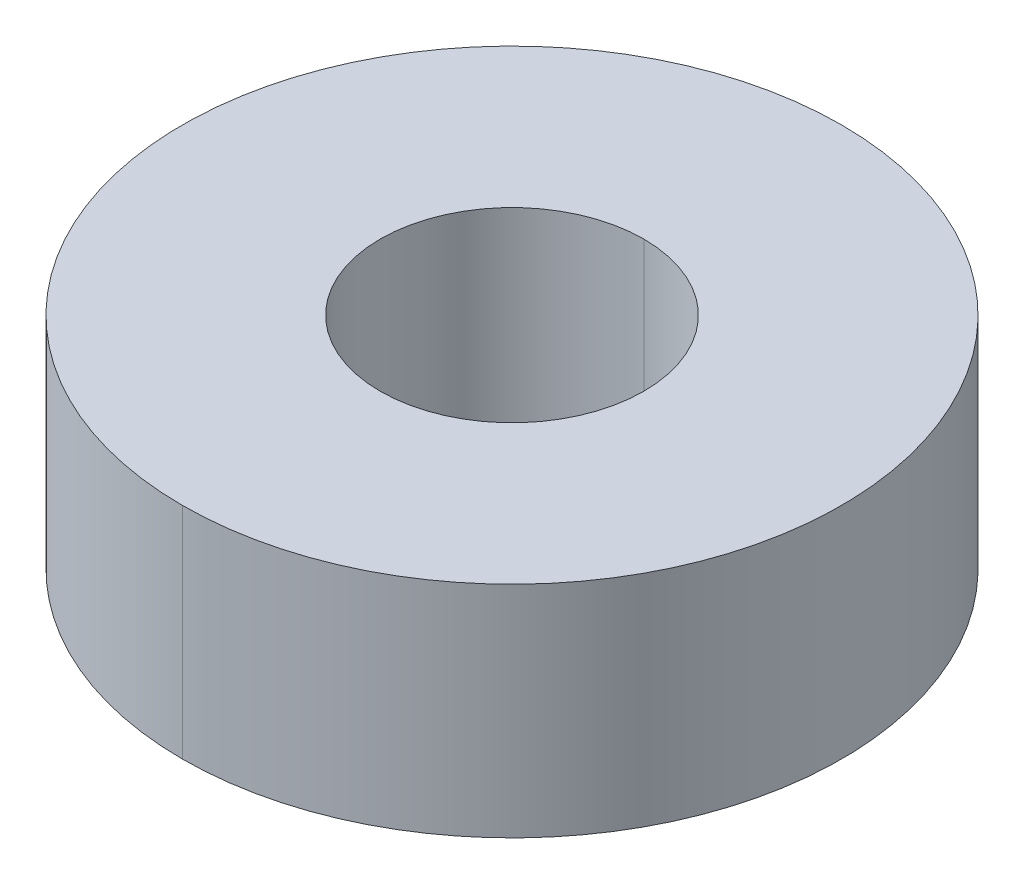
ISO-10303-21;
HEADER;
FILE_DESCRIPTION(('STEP AP214'),'2;1');
FILE_NAME('part.step','',(''),(''),'','','');
FILE_SCHEMA(('AUTOMOTIVE_DESIGN { 1 0 10303 214 1 1 1 1 }'));
ENDSEC;
DATA;
#1=APPLICATION_CONTEXT('core data for automotive mechanical design processes');
#2=APPLICATION_PROTOCOL_DEFINITION('international standard','automotive_design',2000,#1);
#3=PRODUCT_CONTEXT('',#1,'mechanical');
#4=PRODUCT('Part','Part','',(#3));
#5=PRODUCT_RELATED_PRODUCT_CATEGORY('part','',(#4));
#6=PRODUCT_DEFINITION_FORMATION('','',#4);
#7=PRODUCT_DEFINITION_CONTEXT('part definition',#1,'design');
#8=PRODUCT_DEFINITION('design','',#6,#7);
#9=PRODUCT_DEFINITION_SHAPE('','',#8);
#10=(LENGTH_UNIT() NAMED_UNIT(*) SI_UNIT(.MILLI.,.METRE.));
#11=(NAMED_UNIT(*) PLANE_ANGLE_UNIT() SI_UNIT($,.RADIAN.));
#12=(NAMED_UNIT(*) SI_UNIT($,.STERADIAN.) SOLID_ANGLE_UNIT());
#13=UNCERTAINTY_MEASURE_WITH_UNIT(LENGTH_MEASURE(1.E-05),#10,'distance_accuracy_value','');
#14=(GEOMETRIC_REPRESENTATION_CONTEXT(3) GLOBAL_UNCERTAINTY_ASSIGNED_CONTEXT((#13)) GLOBAL_UNIT_ASSIGNED_CONTEXT((#10,
#11,#12)) REPRESENTATION_CONTEXT('',''));
#15=CARTESIAN_POINT('',(0.,0.,0.));
#16=DIRECTION('',(0.,0.,1.));
#17=DIRECTION('',(1.,0.,0.));
#18=AXIS2_PLACEMENT_3D('',#15,#16,#17);
#19=CARTESIAN_POINT('',(0.,5.,0.));
#20=DIRECTION('',(0.,-1.,0.));
#21=DIRECTION('',(0.,0.,-1.));
#22=AXIS2_PLACEMENT_3D('',#19,#20,#21);
#23=CYLINDRICAL_SURFACE('',#22,3.);
#24=DIRECTION('',(0.,-1.,0.));
#25=VECTOR('',#24,1.);
#26=CARTESIAN_POINT('',(0.,5.,3.));
#27=LINE('',#26,#25);
#28=CARTESIAN_POINT('',(0.,5.,3.));
#29=VERTEX_POINT('',#28);
#30=CARTESIAN_POINT('',(0.,0.,3.));
#31=VERTEX_POINT('',#30);
#32=EDGE_CURVE('E90',#29,#31,#27,.T.);
#33=ORIENTED_EDGE('',*,*,#32,.F.);
#34=CARTESIAN_POINT('',(0.,5.,0.));
#35=DIRECTION('',(0.,1.,0.));
#36=DIRECTION('',(0.,0.,1.));
#37=AXIS2_PLACEMENT_3D('',#34,#35,#36);
#38=CIRCLE('',#37,3.);
#39=CARTESIAN_POINT('',(0.,5.,-3.));
#40=VERTEX_POINT('',#39);
#41=EDGE_CURVE('E82',#29,#40,#38,.T.);
#42=ORIENTED_EDGE('',*,*,#41,.T.);
#43=DIRECTION('',(0.,-1.,0.));
#44=VECTOR('',#43,1.);
#45=CARTESIAN_POINT('',(0.,5.,-3.));
#46=LINE('',#45,#44);
#47=CARTESIAN_POINT('',(0.,0.,-3.));
#48=VERTEX_POINT('',#47);
#49=EDGE_CURVE('E81',#40,#48,#46,.T.);
#50=ORIENTED_EDGE('',*,*,#49,.T.);
#51=CARTESIAN_POINT('',(0.,0.,0.));
#52=DIRECTION('',(0.,1.,0.));
#53=DIRECTION('',(0.,0.,1.));
#54=AXIS2_PLACEMENT_3D('',#51,#52,#53);
#55=CIRCLE('',#54,3.);
#56=EDGE_CURVE('E11',#31,#48,#55,.T.);
#57=ORIENTED_EDGE('',*,*,#56,.F.);
#58=EDGE_LOOP('',(#33,#42,#50,#57));
#59=FACE_BOUND('',#58,.T.);
#60=ADVANCED_FACE('F17',(#59),#23,.F.);
#61=CARTESIAN_POINT('',(0.,5.,0.));
#62=DIRECTION('',(0.,-1.,0.));
#63=DIRECTION('',(0.,0.,-1.));
#64=AXIS2_PLACEMENT_3D('',#61,#62,#63);
#65=CYLINDRICAL_SURFACE('',#64,7.5);
#66=DIRECTION('',(0.,-1.,0.));
#67=VECTOR('',#66,1.);
#68=CARTESIAN_POINT('',(0.,5.,7.5));
#69=LINE('',#68,#67);
#70=CARTESIAN_POINT('',(0.,5.,7.5));
#71=VERTEX_POINT('',#70);
#72=CARTESIAN_POINT('',(0.,0.,7.5));
#73=VERTEX_POINT('',#72);
#74=EDGE_CURVE('E100',#71,#73,#69,.T.);
#75=ORIENTED_EDGE('',*,*,#74,.F.);
#76=CARTESIAN_POINT('',(0.,5.,0.));
#77=DIRECTION('',(0.,1.,0.));
#78=DIRECTION('',(0.,0.,1.));
#79=AXIS2_PLACEMENT_3D('',#76,#77,#78);
#80=CIRCLE('',#79,7.5);
#81=CARTESIAN_POINT('',(0.,5.,-7.5));
#82=VERTEX_POINT('',#81);
#83=EDGE_CURVE('E21',#82,#71,#80,.T.);
#84=ORIENTED_EDGE('',*,*,#83,.F.);
#85=DIRECTION('',(0.,-1.,0.));
#86=VECTOR('',#85,1.);
#87=CARTESIAN_POINT('',(0.,5.,-7.5));
#88=LINE('',#87,#86);
#89=CARTESIAN_POINT('',(0.,0.,-7.5));
#90=VERTEX_POINT('',#89);
#91=EDGE_CURVE('E105',#82,#90,#88,.T.);
#92=ORIENTED_EDGE('',*,*,#91,.T.);
#93=CARTESIAN_POINT('',(0.,0.,0.));
#94=DIRECTION('',(0.,1.,0.));
#95=DIRECTION('',(0.,0.,1.));
#96=AXIS2_PLACEMENT_3D('',#93,#94,#95);
#97=CIRCLE('',#96,7.5);
#98=EDGE_CURVE('E27',#90,#73,#97,.T.);
#99=ORIENTED_EDGE('',*,*,#98,.T.);
#100=EDGE_LOOP('',(#75,#84,#92,#99));
#101=FACE_BOUND('',#100,.T.);
#102=ADVANCED_FACE('F127',(#101),#65,.T.);
#103=CARTESIAN_POINT('',(0.,0.,0.));
#104=DIRECTION('',(0.,1.,0.));
#105=DIRECTION('',(1.,0.,0.));
#106=AXIS2_PLACEMENT_3D('',#103,#104,#105);
#107=PLANE('',#106);
#108=CARTESIAN_POINT('',(0.,0.,0.));
#109=DIRECTION('',(0.,1.,0.));
#110=DIRECTION('',(0.,0.,1.));
#111=AXIS2_PLACEMENT_3D('',#108,#109,#110);
#112=CIRCLE('',#111,3.);
#113=EDGE_CURVE('E76',#48,#31,#112,.T.);
#114=ORIENTED_EDGE('',*,*,#113,.T.);
#115=ORIENTED_EDGE('',*,*,#56,.T.);
#116=EDGE_LOOP('',(#114,#115));
#117=FACE_BOUND('',#116,.T.);
#118=ORIENTED_EDGE('',*,*,#98,.F.);
#119=CARTESIAN_POINT('',(0.,0.,0.));
#120=DIRECTION('',(0.,1.,0.));
#121=DIRECTION('',(0.,0.,1.));
#122=AXIS2_PLACEMENT_3D('',#119,#120,#121);
#123=CIRCLE('',#122,7.5);
#124=EDGE_CURVE('E104',#73,#90,#123,.T.);
#125=ORIENTED_EDGE('',*,*,#124,.F.);
#126=EDGE_LOOP('',(#118,#125));
#127=FACE_BOUND('',#126,.T.);
#128=ADVANCED_FACE('F74',(#117,#127),#107,.F.);
#129=CARTESIAN_POINT('',(0.,5.,0.));
#130=DIRECTION('',(0.,1.,0.));
#131=DIRECTION('',(1.,0.,0.));
#132=AXIS2_PLACEMENT_3D('',#129,#130,#131);
#133=PLANE('',#132);
#134=CARTESIAN_POINT('',(0.,5.,0.));
#135=DIRECTION('',(0.,1.,0.));
#136=DIRECTION('',(0.,0.,1.));
#137=AXIS2_PLACEMENT_3D('',#134,#135,#136);
#138=CIRCLE('',#137,3.);
#139=EDGE_CURVE('E97',#40,#29,#138,.T.);
#140=ORIENTED_EDGE('',*,*,#139,.F.);
#141=ORIENTED_EDGE('',*,*,#41,.F.);
#142=EDGE_LOOP('',(#140,#141));
#143=FACE_BOUND('',#142,.T.);
#144=ORIENTED_EDGE('',*,*,#83,.T.);
#145=CARTESIAN_POINT('',(0.,5.,0.));
#146=DIRECTION('',(0.,1.,0.));
#147=DIRECTION('',(0.,0.,1.));
#148=AXIS2_PLACEMENT_3D('',#145,#146,#147);
#149=CIRCLE('',#148,7.5);
#150=EDGE_CURVE('E87',#71,#82,#149,.T.);
#151=ORIENTED_EDGE('',*,*,#150,.T.);
#152=EDGE_LOOP('',(#144,#151));
#153=FACE_BOUND('',#152,.T.);
#154=ADVANCED_FACE('F124',(#143,#153),#133,.T.);
#155=CARTESIAN_POINT('',(0.,5.,0.));
#156=DIRECTION('',(0.,-1.,0.));
#157=DIRECTION('',(0.,0.,-1.));
#158=AXIS2_PLACEMENT_3D('',#155,#156,#157);
#159=CYLINDRICAL_SURFACE('',#158,7.5);
#160=ORIENTED_EDGE('',*,*,#150,.F.);
#161=ORIENTED_EDGE('',*,*,#74,.T.);
#162=ORIENTED_EDGE('',*,*,#124,.T.);
#163=ORIENTED_EDGE('',*,*,#91,.F.);
#164=EDGE_LOOP('',(#160,#161,#162,#163));
#165=FACE_BOUND('',#164,.T.);
#166=ADVANCED_FACE('F19',(#165),#159,.T.);
#167=CARTESIAN_POINT('',(0.,5.,0.));
#168=DIRECTION('',(0.,-1.,0.));
#169=DIRECTION('',(0.,0.,-1.));
#170=AXIS2_PLACEMENT_3D('',#167,#168,#169);
#171=CYLINDRICAL_SURFACE('',#170,3.);
#172=ORIENTED_EDGE('',*,*,#139,.T.);
#173=ORIENTED_EDGE('',*,*,#32,.T.);
#174=ORIENTED_EDGE('',*,*,#113,.F.);
#175=ORIENTED_EDGE('',*,*,#49,.F.);
#176=EDGE_LOOP('',(#172,#173,#174,#175));
#177=FACE_BOUND('',#176,.T.);
#178=ADVANCED_FACE('F89',(#177),#171,.F.);
#179=CLOSED_SHELL('',(#60,#102,#128,#154,#166,#178));
#180=MANIFOLD_SOLID_BREP('B1',#179);
#181=ADVANCED_BREP_SHAPE_REPRESENTATION('',(#18,#180),#14);
#182=SHAPE_DEFINITION_REPRESENTATION(#9,#181);
ENDSEC;
END-ISO-10303-21;
